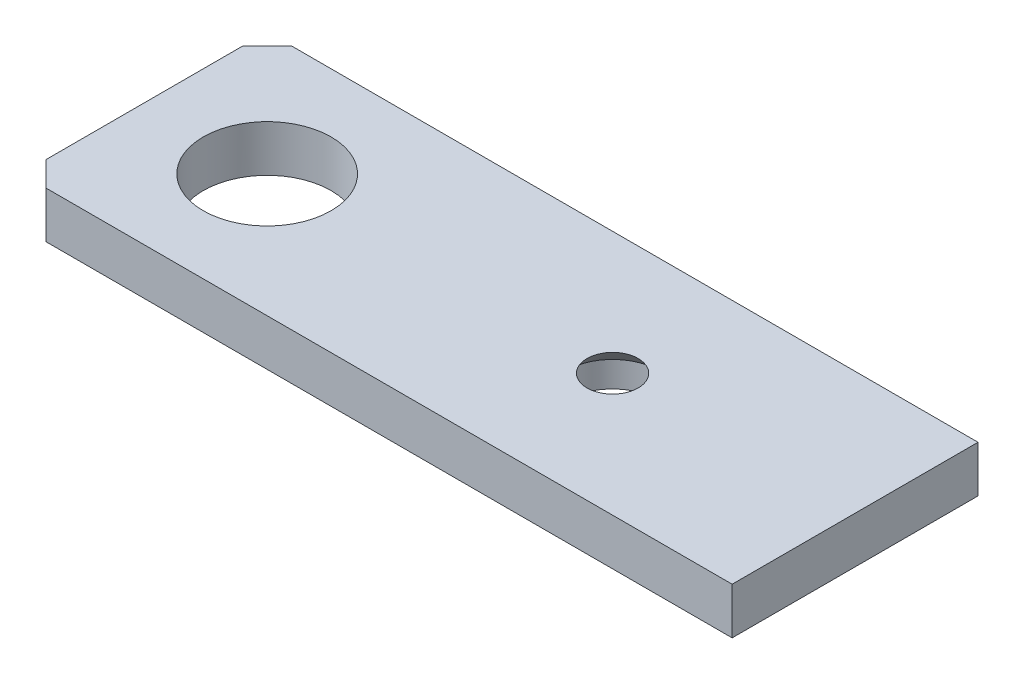
ISO-10303-21;
HEADER;
FILE_DESCRIPTION(('STEP AP214'),'2;1');
FILE_NAME('part.step','',(''),(''),'','','');
FILE_SCHEMA(('AUTOMOTIVE_DESIGN { 1 0 10303 214 1 1 1 1 }'));
ENDSEC;
DATA;
#1=APPLICATION_CONTEXT('core data for automotive mechanical design processes');
#2=APPLICATION_PROTOCOL_DEFINITION('international standard','automotive_design',2000,#1);
#3=PRODUCT_CONTEXT('',#1,'mechanical');
#4=PRODUCT('Part','Part','',(#3));
#5=PRODUCT_RELATED_PRODUCT_CATEGORY('part','',(#4));
#6=PRODUCT_DEFINITION_FORMATION('','',#4);
#7=PRODUCT_DEFINITION_CONTEXT('part definition',#1,'design');
#8=PRODUCT_DEFINITION('design','',#6,#7);
#9=PRODUCT_DEFINITION_SHAPE('','',#8);
#10=(LENGTH_UNIT() NAMED_UNIT(*) SI_UNIT(.MILLI.,.METRE.));
#11=(NAMED_UNIT(*) PLANE_ANGLE_UNIT() SI_UNIT($,.RADIAN.));
#12=(NAMED_UNIT(*) SI_UNIT($,.STERADIAN.) SOLID_ANGLE_UNIT());
#13=UNCERTAINTY_MEASURE_WITH_UNIT(LENGTH_MEASURE(1.E-05),#10,'distance_accuracy_value','');
#14=(GEOMETRIC_REPRESENTATION_CONTEXT(3) GLOBAL_UNCERTAINTY_ASSIGNED_CONTEXT((#13)) GLOBAL_UNIT_ASSIGNED_CONTEXT((#10,
#11,#12)) REPRESENTATION_CONTEXT('',''));
#15=CARTESIAN_POINT('',(0.,0.,0.));
#16=DIRECTION('',(0.,0.,1.));
#17=DIRECTION('',(1.,0.,0.));
#18=AXIS2_PLACEMENT_3D('',#15,#16,#17);
#19=CARTESIAN_POINT('',(0.,2.,0.));
#20=DIRECTION('',(0.,1.,0.));
#21=DIRECTION('',(0.,0.,1.));
#22=AXIS2_PLACEMENT_3D('',#19,#20,#21);
#23=PLANE('',#22);
#24=DIRECTION('',(0.707106781186547,0.,-0.707106781186548));
#25=VECTOR('',#24,1.);
#26=CARTESIAN_POINT('',(-21.15,2.,-16.9073593128807));
#27=LINE('',#26,#25);
#28=CARTESIAN_POINT('',(-21.15,2.,-16.9073593128807));
#29=VERTEX_POINT('',#28);
#30=CARTESIAN_POINT('',(-16.9073593128807,2.,-21.15));
#31=VERTEX_POINT('',#30);
#32=EDGE_CURVE('E99',#29,#31,#27,.T.);
#33=ORIENTED_EDGE('',*,*,#32,.F.);
#34=DIRECTION('',(0.,0.,1.));
#35=VECTOR('',#34,1.);
#36=CARTESIAN_POINT('',(-21.15,2.,21.15));
#37=LINE('',#36,#35);
#38=CARTESIAN_POINT('',(-21.15,2.,16.9073593128807));
#39=VERTEX_POINT('',#38);
#40=EDGE_CURVE('E144',#29,#39,#37,.T.);
#41=ORIENTED_EDGE('',*,*,#40,.T.);
#42=DIRECTION('',(-0.707106781186547,0.,-0.707106781186547));
#43=VECTOR('',#42,1.);
#44=CARTESIAN_POINT('',(-21.15,2.,16.9073593128807));
#45=LINE('',#44,#43);
#46=CARTESIAN_POINT('',(-16.9073593128807,2.,21.15));
#47=VERTEX_POINT('',#46);
#48=EDGE_CURVE('E108',#47,#39,#45,.T.);
#49=ORIENTED_EDGE('',*,*,#48,.F.);
#50=DIRECTION('',(1.,0.,0.));
#51=VECTOR('',#50,1.);
#52=CARTESIAN_POINT('',(21.15,2.,21.15));
#53=LINE('',#52,#51);
#54=CARTESIAN_POINT('',(101.15,2.,21.15));
#55=VERTEX_POINT('',#54);
#56=EDGE_CURVE('E56',#47,#55,#53,.T.);
#57=ORIENTED_EDGE('',*,*,#56,.T.);
#58=DIRECTION('',(0.,0.,-1.));
#59=VECTOR('',#58,1.);
#60=CARTESIAN_POINT('',(101.15,2.,21.15));
#61=LINE('',#60,#59);
#62=CARTESIAN_POINT('',(101.15,2.,-21.15));
#63=VERTEX_POINT('',#62);
#64=EDGE_CURVE('E121',#55,#63,#61,.T.);
#65=ORIENTED_EDGE('',*,*,#64,.T.);
#66=DIRECTION('',(-1.,0.,0.));
#67=VECTOR('',#66,1.);
#68=CARTESIAN_POINT('',(21.15,2.,-21.15));
#69=LINE('',#68,#67);
#70=EDGE_CURVE('E11',#63,#31,#69,.T.);
#71=ORIENTED_EDGE('',*,*,#70,.T.);
#72=EDGE_LOOP('',(#33,#41,#49,#57,#65,#71));
#73=FACE_BOUND('',#72,.T.);
#74=CARTESIAN_POINT('',(0.,2.,0.));
#75=DIRECTION('',(0.,1.,0.));
#76=DIRECTION('',(0.,0.,1.));
#77=AXIS2_PLACEMENT_3D('',#74,#75,#76);
#78=CIRCLE('',#77,11.);
#79=CARTESIAN_POINT('',(0.,2.,11.));
#80=VERTEX_POINT('',#79);
#81=EDGE_CURVE('E139',#80,#80,#78,.T.);
#82=ORIENTED_EDGE('',*,*,#81,.F.);
#83=EDGE_LOOP('',(#82));
#84=FACE_BOUND('',#83,.T.);
#85=CARTESIAN_POINT('',(59.43,2.,0.));
#86=DIRECTION('',(0.,-1.,0.));
#87=DIRECTION('',(0.,0.,-1.));
#88=AXIS2_PLACEMENT_3D('',#85,#86,#87);
#89=CIRCLE('',#88,4.39999999999997);
#90=CARTESIAN_POINT('',(59.43,2.,-4.39999999999997));
#91=VERTEX_POINT('',#90);
#92=EDGE_CURVE('E167',#91,#91,#89,.T.);
#93=ORIENTED_EDGE('',*,*,#92,.T.);
#94=EDGE_LOOP('',(#93));
#95=FACE_BOUND('',#94,.T.);
#96=ADVANCED_FACE('F47',(#73,#84,#95),#23,.T.);
#97=CARTESIAN_POINT('',(-21.15,2.,21.15));
#98=DIRECTION('',(1.,0.,0.));
#99=DIRECTION('',(0.,0.,-1.));
#100=AXIS2_PLACEMENT_3D('',#97,#98,#99);
#101=PLANE('',#100);
#102=ORIENTED_EDGE('',*,*,#40,.F.);
#103=DIRECTION('',(0.,1.,0.));
#104=VECTOR('',#103,1.);
#105=CARTESIAN_POINT('',(-21.15,-12.,-16.9073593128807));
#106=LINE('',#105,#104);
#107=CARTESIAN_POINT('',(-21.15,-6.,-16.9073593128807));
#108=VERTEX_POINT('',#107);
#109=EDGE_CURVE('E102',#108,#29,#106,.T.);
#110=ORIENTED_EDGE('',*,*,#109,.F.);
#111=DIRECTION('',(0.,0.,-1.));
#112=VECTOR('',#111,1.);
#113=CARTESIAN_POINT('',(-21.15,-6.,21.15));
#114=LINE('',#113,#112);
#115=CARTESIAN_POINT('',(-21.15,-6.,16.9073593128807));
#116=VERTEX_POINT('',#115);
#117=EDGE_CURVE('E150',#116,#108,#114,.T.);
#118=ORIENTED_EDGE('',*,*,#117,.F.);
#119=DIRECTION('',(0.,1.,0.));
#120=VECTOR('',#119,1.);
#121=CARTESIAN_POINT('',(-21.15,-12.,16.9073593128807));
#122=LINE('',#121,#120);
#123=EDGE_CURVE('E71',#116,#39,#122,.T.);
#124=ORIENTED_EDGE('',*,*,#123,.T.);
#125=EDGE_LOOP('',(#102,#110,#118,#124));
#126=FACE_BOUND('',#125,.T.);
#127=ADVANCED_FACE('F49',(#126),#101,.F.);
#128=CARTESIAN_POINT('',(21.15,2.,21.15));
#129=DIRECTION('',(0.,0.,-1.));
#130=DIRECTION('',(-1.,0.,0.));
#131=AXIS2_PLACEMENT_3D('',#128,#129,#130);
#132=PLANE('',#131);
#133=ORIENTED_EDGE('',*,*,#56,.F.);
#134=DIRECTION('',(0.,1.,0.));
#135=VECTOR('',#134,1.);
#136=CARTESIAN_POINT('',(-16.9073593128807,-12.,21.15));
#137=LINE('',#136,#135);
#138=CARTESIAN_POINT('',(-16.9073593128807,-6.,21.15));
#139=VERTEX_POINT('',#138);
#140=EDGE_CURVE('E153',#139,#47,#137,.T.);
#141=ORIENTED_EDGE('',*,*,#140,.F.);
#142=DIRECTION('',(-1.,0.,0.));
#143=VECTOR('',#142,1.);
#144=CARTESIAN_POINT('',(101.15,-6.,21.15));
#145=LINE('',#144,#143);
#146=CARTESIAN_POINT('',(101.15,-6.,21.15));
#147=VERTEX_POINT('',#146);
#148=EDGE_CURVE('E179',#147,#139,#145,.T.);
#149=ORIENTED_EDGE('',*,*,#148,.F.);
#150=DIRECTION('',(0.,1.,0.));
#151=VECTOR('',#150,1.);
#152=CARTESIAN_POINT('',(101.15,0.,21.15));
#153=LINE('',#152,#151);
#154=EDGE_CURVE('E127',#147,#55,#153,.T.);
#155=ORIENTED_EDGE('',*,*,#154,.T.);
#156=EDGE_LOOP('',(#133,#141,#149,#155));
#157=FACE_BOUND('',#156,.T.);
#158=ADVANCED_FACE('F192',(#157),#132,.F.);
#159=CARTESIAN_POINT('',(21.15,2.,-21.15));
#160=DIRECTION('',(0.,0.,1.));
#161=DIRECTION('',(1.,0.,0.));
#162=AXIS2_PLACEMENT_3D('',#159,#160,#161);
#163=PLANE('',#162);
#164=DIRECTION('',(1.,0.,0.));
#165=VECTOR('',#164,1.);
#166=CARTESIAN_POINT('',(-21.15,-6.,-21.15));
#167=LINE('',#166,#165);
#168=CARTESIAN_POINT('',(-16.9073593128807,-6.,-21.15));
#169=VERTEX_POINT('',#168);
#170=CARTESIAN_POINT('',(101.15,-6.,-21.15));
#171=VERTEX_POINT('',#170);
#172=EDGE_CURVE('E115',#169,#171,#167,.T.);
#173=ORIENTED_EDGE('',*,*,#172,.F.);
#174=DIRECTION('',(0.,1.,0.));
#175=VECTOR('',#174,1.);
#176=CARTESIAN_POINT('',(-16.9073593128807,-12.,-21.15));
#177=LINE('',#176,#175);
#178=EDGE_CURVE('E63',#169,#31,#177,.T.);
#179=ORIENTED_EDGE('',*,*,#178,.T.);
#180=ORIENTED_EDGE('',*,*,#70,.F.);
#181=DIRECTION('',(0.,1.,0.));
#182=VECTOR('',#181,1.);
#183=CARTESIAN_POINT('',(101.15,0.,-21.15));
#184=LINE('',#183,#182);
#185=EDGE_CURVE('E132',#171,#63,#184,.T.);
#186=ORIENTED_EDGE('',*,*,#185,.F.);
#187=EDGE_LOOP('',(#173,#179,#180,#186));
#188=FACE_BOUND('',#187,.T.);
#189=ADVANCED_FACE('F112',(#188),#163,.F.);
#190=CARTESIAN_POINT('',(0.,2.,0.));
#191=DIRECTION('',(0.,-1.,0.));
#192=DIRECTION('',(0.,0.,-1.));
#193=AXIS2_PLACEMENT_3D('',#190,#191,#192);
#194=CYLINDRICAL_SURFACE('',#193,11.);
#195=ORIENTED_EDGE('',*,*,#81,.T.);
#196=EDGE_LOOP('',(#195));
#197=FACE_BOUND('',#196,.T.);
#198=CARTESIAN_POINT('',(0.,-6.,0.));
#199=DIRECTION('',(0.,-1.,0.));
#200=DIRECTION('',(0.,0.,-1.));
#201=AXIS2_PLACEMENT_3D('',#198,#199,#200);
#202=CIRCLE('',#201,11.);
#203=CARTESIAN_POINT('',(0.,-6.,-11.));
#204=VERTEX_POINT('',#203);
#205=EDGE_CURVE('E171',#204,#204,#202,.T.);
#206=ORIENTED_EDGE('',*,*,#205,.T.);
#207=EDGE_LOOP('',(#206));
#208=FACE_BOUND('',#207,.T.);
#209=ADVANCED_FACE('F212',(#197,#208),#194,.F.);
#210=CARTESIAN_POINT('',(101.15,0.,21.15));
#211=DIRECTION('',(1.,0.,0.));
#212=DIRECTION('',(0.,0.,-1.));
#213=AXIS2_PLACEMENT_3D('',#210,#211,#212);
#214=PLANE('',#213);
#215=ORIENTED_EDGE('',*,*,#64,.F.);
#216=ORIENTED_EDGE('',*,*,#154,.F.);
#217=DIRECTION('',(0.,0.,1.));
#218=VECTOR('',#217,1.);
#219=CARTESIAN_POINT('',(101.15,-6.,-21.15));
#220=LINE('',#219,#218);
#221=EDGE_CURVE('E128',#171,#147,#220,.T.);
#222=ORIENTED_EDGE('',*,*,#221,.F.);
#223=ORIENTED_EDGE('',*,*,#185,.T.);
#224=EDGE_LOOP('',(#215,#216,#222,#223));
#225=FACE_BOUND('',#224,.T.);
#226=ADVANCED_FACE('F190',(#225),#214,.T.);
#227=CARTESIAN_POINT('',(59.43,0.,0.));
#228=DIRECTION('',(0.,1.,0.));
#229=DIRECTION('',(0.,0.,1.));
#230=AXIS2_PLACEMENT_3D('',#227,#228,#229);
#231=CYLINDRICAL_SURFACE('',#230,8.00000000000001);
#232=CARTESIAN_POINT('',(59.43,-1.6,0.));
#233=DIRECTION('',(0.,-1.,0.));
#234=DIRECTION('',(0.,0.,-1.));
#235=AXIS2_PLACEMENT_3D('',#232,#233,#234);
#236=CIRCLE('',#235,8.00000000000001);
#237=CARTESIAN_POINT('',(59.43,-1.6,-8.00000000000001));
#238=VERTEX_POINT('',#237);
#239=EDGE_CURVE('E163',#238,#238,#236,.T.);
#240=ORIENTED_EDGE('',*,*,#239,.F.);
#241=EDGE_LOOP('',(#240));
#242=FACE_BOUND('',#241,.T.);
#243=CARTESIAN_POINT('',(59.43,-6.,0.));
#244=DIRECTION('',(0.,-1.,0.));
#245=DIRECTION('',(0.,0.,-1.));
#246=AXIS2_PLACEMENT_3D('',#243,#244,#245);
#247=CIRCLE('',#246,8.00000000000001);
#248=CARTESIAN_POINT('',(59.43,-6.,-8.00000000000001));
#249=VERTEX_POINT('',#248);
#250=EDGE_CURVE('E175',#249,#249,#247,.T.);
#251=ORIENTED_EDGE('',*,*,#250,.T.);
#252=EDGE_LOOP('',(#251));
#253=FACE_BOUND('',#252,.T.);
#254=ADVANCED_FACE('F236',(#242,#253),#231,.F.);
#255=CARTESIAN_POINT('',(0.,-6.,0.));
#256=DIRECTION('',(0.,-1.,0.));
#257=DIRECTION('',(0.,0.,-1.));
#258=AXIS2_PLACEMENT_3D('',#255,#256,#257);
#259=PLANE('',#258);
#260=DIRECTION('',(0.707106781186547,0.,-0.707106781186548));
#261=VECTOR('',#260,1.);
#262=CARTESIAN_POINT('',(-21.15,-6.,-16.9073593128807));
#263=LINE('',#262,#261);
#264=EDGE_CURVE('E107',#108,#169,#263,.T.);
#265=ORIENTED_EDGE('',*,*,#264,.T.);
#266=ORIENTED_EDGE('',*,*,#172,.T.);
#267=ORIENTED_EDGE('',*,*,#221,.T.);
#268=ORIENTED_EDGE('',*,*,#148,.T.);
#269=DIRECTION('',(-0.707106781186548,0.,-0.707106781186548));
#270=VECTOR('',#269,1.);
#271=CARTESIAN_POINT('',(-21.15,-6.,16.9073593128807));
#272=LINE('',#271,#270);
#273=EDGE_CURVE('E152',#139,#116,#272,.T.);
#274=ORIENTED_EDGE('',*,*,#273,.T.);
#275=ORIENTED_EDGE('',*,*,#117,.T.);
#276=EDGE_LOOP('',(#265,#266,#267,#268,#274,#275));
#277=FACE_BOUND('',#276,.T.);
#278=ORIENTED_EDGE('',*,*,#250,.F.);
#279=EDGE_LOOP('',(#278));
#280=FACE_BOUND('',#279,.T.);
#281=ORIENTED_EDGE('',*,*,#205,.F.);
#282=EDGE_LOOP('',(#281));
#283=FACE_BOUND('',#282,.T.);
#284=ADVANCED_FACE('F186',(#277,#280,#283),#259,.T.);
#285=CARTESIAN_POINT('',(59.43,2.,0.));
#286=DIRECTION('',(0.,-1.,0.));
#287=DIRECTION('',(0.,0.,-1.));
#288=AXIS2_PLACEMENT_3D('',#285,#286,#287);
#289=CONICAL_SURFACE('',#288,4.39999999999997,0.785398163397453);
#290=ORIENTED_EDGE('',*,*,#239,.T.);
#291=EDGE_LOOP('',(#290));
#292=FACE_BOUND('',#291,.T.);
#293=ORIENTED_EDGE('',*,*,#92,.F.);
#294=EDGE_LOOP('',(#293));
#295=FACE_BOUND('',#294,.T.);
#296=ADVANCED_FACE('F196',(#292,#295),#289,.F.);
#297=CARTESIAN_POINT('',(-21.15,-12.,16.9073593128807));
#298=DIRECTION('',(0.707106781186548,0.,-0.707106781186548));
#299=DIRECTION('',(-0.707106781186548,0.,-0.707106781186548));
#300=AXIS2_PLACEMENT_3D('',#297,#298,#299);
#301=PLANE('',#300);
#302=ORIENTED_EDGE('',*,*,#140,.T.);
#303=ORIENTED_EDGE('',*,*,#48,.T.);
#304=ORIENTED_EDGE('',*,*,#123,.F.);
#305=ORIENTED_EDGE('',*,*,#273,.F.);
#306=EDGE_LOOP('',(#302,#303,#304,#305));
#307=FACE_BOUND('',#306,.T.);
#308=ADVANCED_FACE('F194',(#307),#301,.F.);
#309=CARTESIAN_POINT('',(-21.15,-12.,-16.9073593128807));
#310=DIRECTION('',(0.707106781186548,0.,0.707106781186547));
#311=DIRECTION('',(0.707106781186547,0.,-0.707106781186548));
#312=AXIS2_PLACEMENT_3D('',#309,#310,#311);
#313=PLANE('',#312);
#314=ORIENTED_EDGE('',*,*,#109,.T.);
#315=ORIENTED_EDGE('',*,*,#32,.T.);
#316=ORIENTED_EDGE('',*,*,#178,.F.);
#317=ORIENTED_EDGE('',*,*,#264,.F.);
#318=EDGE_LOOP('',(#314,#315,#316,#317));
#319=FACE_BOUND('',#318,.T.);
#320=ADVANCED_FACE('F100',(#319),#313,.F.);
#321=CLOSED_SHELL('',(#96,#127,#158,#189,#209,#226,#254,#284,#296,#308,#320));
#322=MANIFOLD_SOLID_BREP('B2',#321);
#323=ADVANCED_BREP_SHAPE_REPRESENTATION('',(#18,#322),#14);
#324=SHAPE_DEFINITION_REPRESENTATION(#9,#323);
ENDSEC;
END-ISO-10303-21;
